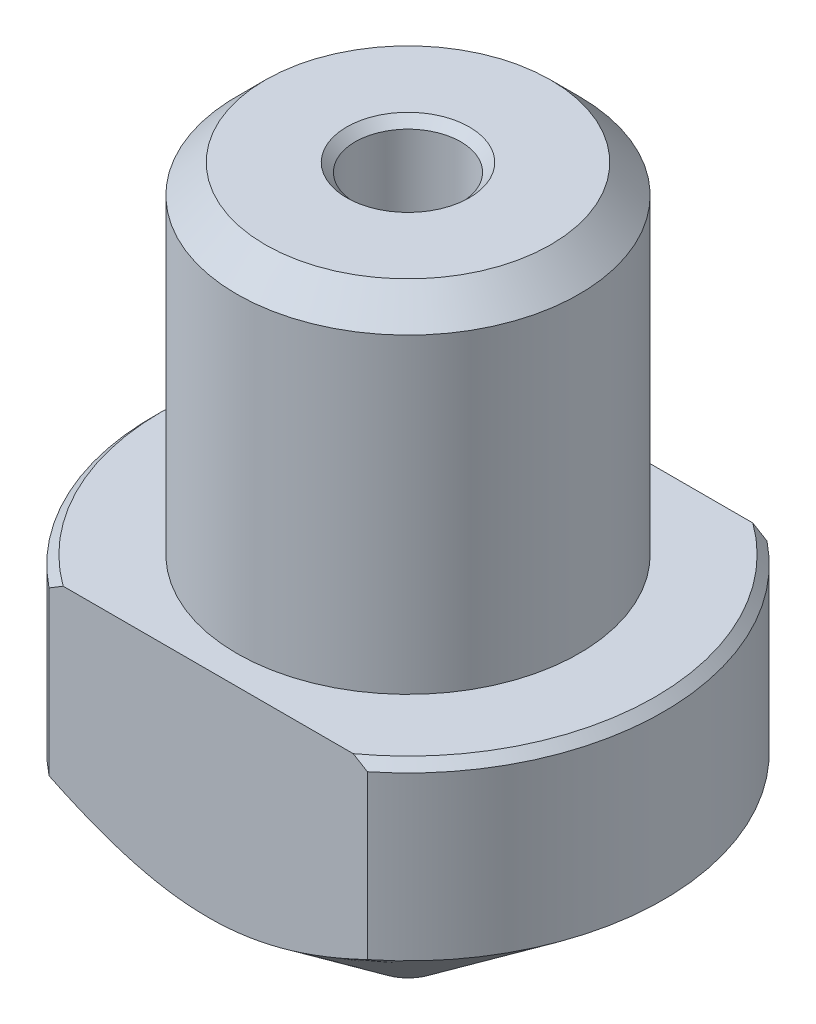
ISO-10303-21;
HEADER;
FILE_DESCRIPTION(('STEP AP214'),'2;1');
FILE_NAME('part.step','',(''),(''),'','','');
FILE_SCHEMA(('AUTOMOTIVE_DESIGN { 1 0 10303 214 1 1 1 1 }'));
ENDSEC;
DATA;
#1=APPLICATION_CONTEXT('core data for automotive mechanical design processes');
#2=APPLICATION_PROTOCOL_DEFINITION('international standard','automotive_design',2000,#1);
#3=PRODUCT_CONTEXT('',#1,'mechanical');
#4=PRODUCT('Part','Part','',(#3));
#5=PRODUCT_RELATED_PRODUCT_CATEGORY('part','',(#4));
#6=PRODUCT_DEFINITION_FORMATION('','',#4);
#7=PRODUCT_DEFINITION_CONTEXT('part definition',#1,'design');
#8=PRODUCT_DEFINITION('design','',#6,#7);
#9=PRODUCT_DEFINITION_SHAPE('','',#8);
#10=(LENGTH_UNIT() NAMED_UNIT(*) SI_UNIT(.MILLI.,.METRE.));
#11=(NAMED_UNIT(*) PLANE_ANGLE_UNIT() SI_UNIT($,.RADIAN.));
#12=(NAMED_UNIT(*) SI_UNIT($,.STERADIAN.) SOLID_ANGLE_UNIT());
#13=UNCERTAINTY_MEASURE_WITH_UNIT(LENGTH_MEASURE(1.E-05),#10,'distance_accuracy_value','');
#14=(GEOMETRIC_REPRESENTATION_CONTEXT(3) GLOBAL_UNCERTAINTY_ASSIGNED_CONTEXT((#13)) GLOBAL_UNIT_ASSIGNED_CONTEXT((#10,
#11,#12)) REPRESENTATION_CONTEXT('',''));
#15=CARTESIAN_POINT('',(0.,0.,0.));
#16=DIRECTION('',(0.,0.,1.));
#17=DIRECTION('',(1.,0.,0.));
#18=AXIS2_PLACEMENT_3D('',#15,#16,#17);
#19=CARTESIAN_POINT('',(0.,16.0512029311638,0.));
#20=DIRECTION('',(0.,1.,0.));
#21=DIRECTION('',(0.,0.,1.));
#22=AXIS2_PLACEMENT_3D('',#19,#20,#21);
#23=CYLINDRICAL_SURFACE('',#22,4.475);
#24=DIRECTION('',(0.,1.,0.));
#25=VECTOR('',#24,1.);
#26=CARTESIAN_POINT('',(-2.78848076916446,16.0512029311638,3.5));
#27=LINE('',#26,#25);
#28=CARTESIAN_POINT('',(-2.78848076916446,-0.150000000000001,3.5));
#29=VERTEX_POINT('',#28);
#30=CARTESIAN_POINT('',(-2.78848076916446,-3.,3.5));
#31=VERTEX_POINT('',#30);
#32=EDGE_CURVE('E114',#29,#31,#27,.F.);
#33=ORIENTED_EDGE('',*,*,#32,.F.);
#34=CARTESIAN_POINT('',(0.,-0.150000000000001,0.));
#35=DIRECTION('',(0.,-1.,0.));
#36=DIRECTION('',(0.,0.,-1.));
#37=AXIS2_PLACEMENT_3D('',#34,#35,#36);
#38=CIRCLE('',#37,4.475);
#39=CARTESIAN_POINT('',(-2.78848076916446,-0.150000000000001,-3.5));
#40=VERTEX_POINT('',#39);
#41=EDGE_CURVE('E70',#29,#40,#38,.T.);
#42=ORIENTED_EDGE('',*,*,#41,.T.);
#43=DIRECTION('',(0.,1.,0.));
#44=VECTOR('',#43,1.);
#45=CARTESIAN_POINT('',(-2.78848076916446,16.0512029311638,-3.5));
#46=LINE('',#45,#44);
#47=CARTESIAN_POINT('',(-2.78848076916446,-3.,-3.5));
#48=VERTEX_POINT('',#47);
#49=EDGE_CURVE('E211',#48,#40,#46,.T.);
#50=ORIENTED_EDGE('',*,*,#49,.F.);
#51=CARTESIAN_POINT('',(0.,-3.,0.));
#52=DIRECTION('',(0.,1.,0.));
#53=DIRECTION('',(0.,0.,1.));
#54=AXIS2_PLACEMENT_3D('',#51,#52,#53);
#55=CIRCLE('',#54,4.475);
#56=EDGE_CURVE('E134',#48,#31,#55,.T.);
#57=ORIENTED_EDGE('',*,*,#56,.T.);
#58=EDGE_LOOP('',(#33,#42,#50,#57));
#59=FACE_BOUND('',#58,.T.);
#60=ADVANCED_FACE('F40',(#59),#23,.T.);
#61=CARTESIAN_POINT('',(0.,-4.43870967741935,0.));
#62=DIRECTION('',(0.,1.,0.));
#63=DIRECTION('',(0.,0.,1.));
#64=AXIS2_PLACEMENT_3D('',#61,#62,#63);
#65=CONICAL_SURFACE('',#64,0.925000000000002,0.911990290677417);
#66=CARTESIAN_POINT('',(0.,-5.,0.));
#67=DIRECTION('',(0.,1.,0.));
#68=DIRECTION('',(0.,0.,1.));
#69=AXIS2_PLACEMENT_3D('',#66,#67,#68);
#70=CIRCLE('',#69,0.200000000000003);
#71=CARTESIAN_POINT('',(0.,-5.,0.200000000000002));
#72=VERTEX_POINT('',#71);
#73=EDGE_CURVE('E153',#72,#72,#70,.T.);
#74=CARTESIAN_POINT('',(0.,-4.43870967741935,0.));
#75=DIRECTION('',(0.,1.,0.));
#76=DIRECTION('',(0.,0.,1.));
#77=AXIS2_PLACEMENT_3D('',#74,#75,#76);
#78=CIRCLE('',#77,0.925000000000002);
#79=CARTESIAN_POINT('',(0.,-4.43870967741935,0.925000000000002));
#80=VERTEX_POINT('',#79);
#81=EDGE_CURVE('E142',#80,#80,#78,.T.);
#82=CARTESIAN_POINT('',(0.,-5.,0.200000000000002));
#83=CARTESIAN_POINT('',(0.,-4.99415322580645,0.207552083333336));
#84=CARTESIAN_POINT('',(0.,-4.9883064516129,0.215104166666669));
#85=CARTESIAN_POINT('',(0.,-4.97661290322581,0.230208333333336));
#86=CARTESIAN_POINT('',(0.,-4.97076612903226,0.237760416666669));
#87=CARTESIAN_POINT('',(0.,-4.95907258064516,0.252864583333335));
#88=CARTESIAN_POINT('',(0.,-4.95322580645161,0.260416666666669));
#89=CARTESIAN_POINT('',(0.,-4.94153225806452,0.275520833333336));
#90=CARTESIAN_POINT('',(0.,-4.93568548387097,0.283072916666669));
#91=CARTESIAN_POINT('',(0.,-4.92399193548387,0.298177083333335));
#92=CARTESIAN_POINT('',(0.,-4.91814516129032,0.305729166666669));
#93=CARTESIAN_POINT('',(0.,-4.90645161290323,0.320833333333336));
#94=CARTESIAN_POINT('',(0.,-4.90060483870968,0.328385416666669));
#95=CARTESIAN_POINT('',(0.,-4.88891129032258,0.343489583333335));
#96=CARTESIAN_POINT('',(0.,-4.88306451612903,0.351041666666669));
#97=CARTESIAN_POINT('',(0.,-4.87137096774194,0.366145833333336));
#98=CARTESIAN_POINT('',(0.,-4.86552419354839,0.373697916666669));
#99=CARTESIAN_POINT('',(0.,-4.85383064516129,0.388802083333335));
#100=CARTESIAN_POINT('',(0.,-4.84798387096774,0.396354166666669));
#101=CARTESIAN_POINT('',(0.,-4.83629032258065,0.411458333333336));
#102=CARTESIAN_POINT('',(0.,-4.8304435483871,0.419010416666669));
#103=CARTESIAN_POINT('',(0.,-4.81875,0.434114583333335));
#104=CARTESIAN_POINT('',(0.,-4.81290322580645,0.441666666666669));
#105=CARTESIAN_POINT('',(0.,-4.80120967741936,0.456770833333336));
#106=CARTESIAN_POINT('',(0.,-4.79536290322581,0.464322916666669));
#107=CARTESIAN_POINT('',(0.,-4.78366935483871,0.479427083333335));
#108=CARTESIAN_POINT('',(0.,-4.77782258064516,0.486979166666669));
#109=CARTESIAN_POINT('',(0.,-4.76612903225806,0.502083333333336));
#110=CARTESIAN_POINT('',(0.,-4.76028225806452,0.509635416666669));
#111=CARTESIAN_POINT('',(0.,-4.74858870967742,0.524739583333335));
#112=CARTESIAN_POINT('',(0.,-4.74274193548387,0.532291666666669));
#113=CARTESIAN_POINT('',(0.,-4.73104838709677,0.547395833333336));
#114=CARTESIAN_POINT('',(0.,-4.72520161290322,0.554947916666669));
#115=CARTESIAN_POINT('',(0.,-4.71350806451613,0.570052083333335));
#116=CARTESIAN_POINT('',(0.,-4.70766129032258,0.577604166666669));
#117=CARTESIAN_POINT('',(0.,-4.69596774193548,0.592708333333336));
#118=CARTESIAN_POINT('',(0.,-4.69012096774193,0.600260416666669));
#119=CARTESIAN_POINT('',(0.,-4.67842741935484,0.615364583333335));
#120=CARTESIAN_POINT('',(0.,-4.67258064516129,0.622916666666669));
#121=CARTESIAN_POINT('',(0.,-4.66088709677419,0.638020833333336));
#122=CARTESIAN_POINT('',(0.,-4.65504032258064,0.645572916666668));
#123=CARTESIAN_POINT('',(0.,-4.64334677419355,0.660677083333335));
#124=CARTESIAN_POINT('',(0.,-4.6375,0.668229166666669));
#125=CARTESIAN_POINT('',(0.,-4.6258064516129,0.683333333333336));
#126=CARTESIAN_POINT('',(0.,-4.61995967741935,0.690885416666669));
#127=CARTESIAN_POINT('',(0.,-4.60826612903226,0.705989583333335));
#128=CARTESIAN_POINT('',(0.,-4.60241935483871,0.713541666666669));
#129=CARTESIAN_POINT('',(0.,-4.59072580645161,0.728645833333335));
#130=CARTESIAN_POINT('',(0.,-4.58487903225806,0.736197916666669));
#131=CARTESIAN_POINT('',(0.,-4.57318548387097,0.751302083333335));
#132=CARTESIAN_POINT('',(0.,-4.56733870967742,0.758854166666669));
#133=CARTESIAN_POINT('',(0.,-4.55564516129032,0.773958333333336));
#134=CARTESIAN_POINT('',(0.,-4.54979838709677,0.781510416666669));
#135=CARTESIAN_POINT('',(0.,-4.53810483870968,0.796614583333335));
#136=CARTESIAN_POINT('',(0.,-4.53225806451613,0.804166666666669));
#137=CARTESIAN_POINT('',(0.,-4.52056451612903,0.819270833333336));
#138=CARTESIAN_POINT('',(0.,-4.51471774193548,0.826822916666669));
#139=CARTESIAN_POINT('',(0.,-4.50302419354839,0.841927083333335));
#140=CARTESIAN_POINT('',(0.,-4.49717741935484,0.849479166666669));
#141=CARTESIAN_POINT('',(0.,-4.48548387096774,0.864583333333335));
#142=CARTESIAN_POINT('',(0.,-4.47963709677419,0.872135416666668));
#143=CARTESIAN_POINT('',(0.,-4.46794354838709,0.887239583333335));
#144=CARTESIAN_POINT('',(0.,-4.46209677419355,0.894791666666669));
#145=CARTESIAN_POINT('',(0.,-4.45040322580645,0.909895833333336));
#146=CARTESIAN_POINT('',(0.,-4.4445564516129,0.917447916666669));
#147=CARTESIAN_POINT('',(0.,-4.43870967741935,0.925000000000002));
#148=B_SPLINE_CURVE_WITH_KNOTS('',3,(#82,#83,#84,#85,#86,#87,#88,#89,#90,#91,#92,#93,#94,#95,
#96,#97,#98,#99,#100,#101,#102,#103,#104,#105,#106,#107,#108,#109,#110,#111,#112,#113,#114,#115,
#116,#117,#118,#119,#120,#121,#122,#123,#124,#125,#126,#127,#128,#129,#130,#131,#132,#133,#134,
#135,#136,#137,#138,#139,#140,#141,#142,#143,#144,#145,#146,#147),.UNSPECIFIED.,.F.,.F.,(4,2,2,
2,2,2,2,2,2,2,2,2,2,2,2,2,2,2,2,2,2,2,2,2,2,2,2,2,2,2,2,2,4),(0.,0.0286525492809203,
0.0573050985618416,0.0859576478427617,0.114610197123683,0.143262746404603,0.171915295685525,
0.200567844966445,0.229220394247366,0.257872943528286,0.286525492809208,0.315178042090128,
0.343830591371049,0.37248314065197,0.401135689932891,0.429788239213811,0.458440788494733,
0.487093337775653,0.515745887056574,0.544398436337494,0.573050985618416,0.601703534899336,
0.630356084180257,0.659008633461177,0.687661182742099,0.716313732023019,0.74496628130394,
0.77361883058486,0.802271379865782,0.830923929146702,0.859576478427623,0.888229027708544,
0.916881576989465),.UNSPECIFIED.);
#149=EDGE_CURVE('BSEAM252',#72,#80,#148,.T.);
#150=ORIENTED_EDGE('',*,*,#73,.F.);
#151=ORIENTED_EDGE('',*,*,#81,.T.);
#152=ORIENTED_EDGE('',*,*,#149,.T.);
#153=ORIENTED_EDGE('',*,*,#149,.F.);
#154=EDGE_LOOP('',(#150,#152,#151,#153));
#155=FACE_BOUND('',#154,.T.);
#156=ADVANCED_FACE('F252',(#155),#65,.F.);
#157=CARTESIAN_POINT('',(0.,16.0512029311638,0.));
#158=DIRECTION('',(0.,1.,0.));
#159=DIRECTION('',(0.,0.,1.));
#160=AXIS2_PLACEMENT_3D('',#157,#158,#159);
#161=CYLINDRICAL_SURFACE('',#160,0.200000000000003);
#162=CARTESIAN_POINT('',(0.,-6.,0.));
#163=DIRECTION('',(0.,1.,0.));
#164=DIRECTION('',(0.,0.,1.));
#165=AXIS2_PLACEMENT_3D('',#162,#163,#164);
#166=CIRCLE('',#165,0.200000000000003);
#167=CARTESIAN_POINT('',(0.,-6.,0.200000000000003));
#168=VERTEX_POINT('',#167);
#169=EDGE_CURVE('E149',#168,#168,#166,.T.);
#170=ORIENTED_EDGE('',*,*,#169,.F.);
#171=EDGE_LOOP('',(#170));
#172=FACE_BOUND('',#171,.T.);
#173=ORIENTED_EDGE('',*,*,#73,.T.);
#174=EDGE_LOOP('',(#173));
#175=FACE_BOUND('',#174,.T.);
#176=ADVANCED_FACE('F255',(#172,#175),#161,.F.);
#177=CARTESIAN_POINT('',(0.,-6.,-0.600000000000003));
#178=DIRECTION('',(0.,1.,0.));
#179=DIRECTION('',(0.,0.,1.));
#180=AXIS2_PLACEMENT_3D('',#177,#178,#179);
#181=PLANE('',#180);
#182=CARTESIAN_POINT('',(0.,-6.,0.));
#183=DIRECTION('',(0.,1.,0.));
#184=DIRECTION('',(0.,0.,1.));
#185=AXIS2_PLACEMENT_3D('',#182,#183,#184);
#186=CIRCLE('',#185,0.600000000000003);
#187=CARTESIAN_POINT('',(0.,-6.,0.600000000000003));
#188=VERTEX_POINT('',#187);
#189=EDGE_CURVE('E139',#188,#188,#186,.T.);
#190=ORIENTED_EDGE('',*,*,#189,.F.);
#191=EDGE_LOOP('',(#190));
#192=FACE_BOUND('',#191,.T.);
#193=ORIENTED_EDGE('',*,*,#169,.T.);
#194=EDGE_LOOP('',(#193));
#195=FACE_BOUND('',#194,.T.);
#196=ADVANCED_FACE('F259',(#192,#195),#181,.F.);
#197=CARTESIAN_POINT('',(0.,-6.,0.));
#198=DIRECTION('',(0.,1.,0.));
#199=DIRECTION('',(0.,0.,1.));
#200=AXIS2_PLACEMENT_3D('',#197,#198,#199);
#201=CONICAL_SURFACE('',#200,0.600000000000003,0.91199029067742);
#202=CARTESIAN_POINT('',(2.78848076916446,-3.,3.5));
#203=VERTEX_POINT('',#202);
#204=CARTESIAN_POINT('',(2.78848076916446,-3.,-3.5));
#205=VERTEX_POINT('',#204);
#206=EDGE_CURVE('E125',#203,#205,#55,.T.);
#207=ORIENTED_EDGE('',*,*,#206,.F.);
#208=CARTESIAN_POINT('',(-5.88189790488484,-1.16557424940452,3.5));
#209=CARTESIAN_POINT('',(-5.73164839963552,-1.26551564660223,3.5));
#210=CARTESIAN_POINT('',(-5.58095230263866,-1.36479466175223,3.5));
#211=CARTESIAN_POINT('',(-5.27842902790053,-1.56166405671316,3.5));
#212=CARTESIAN_POINT('',(-5.12660167952328,-1.65925417408259,3.5));
#213=CARTESIAN_POINT('',(-4.82067036325214,-1.85295477676805,3.5));
#214=CARTESIAN_POINT('',(-4.66655809541282,-1.94905218920537,3.5));
#215=CARTESIAN_POINT('',(-4.3567143218424,-2.13858652847236,3.5));
#216=CARTESIAN_POINT('',(-4.20098290927845,-2.23202360723621,3.5));
#217=CARTESIAN_POINT('',(-3.87491605471066,-2.42290865719028,3.5));
#218=CARTESIAN_POINT('',(-3.70441428825805,-2.52007388162644,3.5));
#219=CARTESIAN_POINT('',(-3.36049763353232,-2.70921604369285,3.5));
#220=CARTESIAN_POINT('',(-3.18708221624171,-2.80119202563265,3.5));
#221=CARTESIAN_POINT('',(-2.83709845323278,-2.97793111620599,3.5));
#222=CARTESIAN_POINT('',(-2.6605385572302,-3.0627108082161,3.5));
#223=CARTESIAN_POINT('',(-2.30318864381273,-3.22273985502127,3.5));
#224=CARTESIAN_POINT('',(-2.12240064602443,-3.2979936541523,3.5));
#225=CARTESIAN_POINT('',(-1.76846168216527,-3.43078336805719,3.5));
#226=CARTESIAN_POINT('',(-1.59563977673534,-3.4891815246618,3.5));
#227=CARTESIAN_POINT('',(-1.2456112664733,-3.59109093792747,3.5));
#228=CARTESIAN_POINT('',(-1.06840582565859,-3.63460610211119,3.5));
#229=CARTESIAN_POINT('',(-0.714678271749285,-3.70201702738933,3.5));
#230=CARTESIAN_POINT('',(-0.538247114326054,-3.72637023860228,3.5));
#231=CARTESIAN_POINT('',(-0.272445369032831,-3.74750459445033,3.5));
#232=CARTESIAN_POINT('',(-0.183646484765789,-3.75198326050827,3.5));
#233=CARTESIAN_POINT('',(-0.00594076877256364,-3.75570687383801,3.5));
#234=CARTESIAN_POINT('',(0.0829660582366901,-3.7549520421194,3.5));
#235=CARTESIAN_POINT('',(0.323617200759191,-3.74580719647845,3.5));
#236=CARTESIAN_POINT('',(0.475193498155028,-3.73238037034587,3.5));
#237=CARTESIAN_POINT('',(0.776358240663111,-3.69135825867512,3.5));
#238=CARTESIAN_POINT('',(0.925946460846536,-3.66376138371957,3.5));
#239=CARTESIAN_POINT('',(1.22594553501344,-3.5956243811889,3.5));
#240=CARTESIAN_POINT('',(1.37628747294569,-3.55478499462746,3.5));
#241=CARTESIAN_POINT('',(1.59934140509133,-3.48580781480235,3.5));
#242=CARTESIAN_POINT('',(1.67328481514843,-3.46152832524748,3.5));
#243=CARTESIAN_POINT('',(1.82037791106009,-3.41067358990004,3.5));
#244=CARTESIAN_POINT('',(1.89352761637576,-3.38409840054037,3.5));
#245=CARTESIAN_POINT('',(2.09002442210262,-3.30958929853729,3.5));
#246=CARTESIAN_POINT('',(2.21264294264996,-3.25973322547316,3.5));
#247=CARTESIAN_POINT('',(2.45584671742397,-3.15526213378025,3.5));
#248=CARTESIAN_POINT('',(2.57643152577103,-3.10064608733546,3.5));
#249=CARTESIAN_POINT('',(2.81586773563287,-2.98752456491837,3.5));
#250=CARTESIAN_POINT('',(2.93471773936787,-2.92901614320467,3.5));
#251=CARTESIAN_POINT('',(3.17082474112645,-2.80886029874127,3.5));
#252=CARTESIAN_POINT('',(3.28808160426777,-2.74721261227983,3.5));
#253=CARTESIAN_POINT('',(3.63878757772353,-2.55790859207043,3.5));
#254=CARTESIAN_POINT('',(3.87014870011178,-2.42638713364467,3.5));
#255=CARTESIAN_POINT('',(4.32861994087952,-2.15642906638853,3.5));
#256=CARTESIAN_POINT('',(4.55573178342356,-2.01799534972697,3.5));
#257=CARTESIAN_POINT('',(4.98350527147858,-1.75075851108294,3.5));
#258=CARTESIAN_POINT('',(5.18447171485298,-1.62244148390226,3.5));
#259=CARTESIAN_POINT('',(5.58447429630348,-1.3627927154809,3.5));
#260=CARTESIAN_POINT('',(5.78351021261082,-1.23146063358691,3.5));
#261=CARTESIAN_POINT('',(6.17812595454277,-0.967775815235563,3.5));
#262=CARTESIAN_POINT('',(6.37372059298669,-0.835445192360116,3.5));
#263=CARTESIAN_POINT('',(6.76364346658176,-0.569011118431182,3.5));
#264=CARTESIAN_POINT('',(6.95797194231317,-0.434908019750318,3.5));
#265=CARTESIAN_POINT('',(7.1518280143833,-0.30013429075097,3.5));
#266=B_SPLINE_CURVE_WITH_KNOTS('',3,(#208,#209,#210,#211,#212,#213,#214,#215,#216,#217,#218,
#219,#220,#221,#222,#223,#224,#225,#226,#227,#228,#229,#230,#231,#232,#233,#234,#235,#236,#237,
#238,#239,#240,#241,#242,#243,#244,#245,#246,#247,#248,#249,#250,#251,#252,#253,#254,#255,#256,
#257,#258,#259,#260,#261,#262,#263,#264,#265),.UNSPECIFIED.,.F.,.F.,(4,2,2,2,2,2,2,2,2,2,2,2,2,
2,2,2,2,2,2,2,2,2,2,2,2,2,2,2,4),(0.,0.541363930478592,1.08281124270189,1.62764522053172,
2.17244801970772,2.76111376271559,3.34988756735981,3.93726550139954,4.52436837433031,
5.07112153741645,5.61773104032323,6.15085809063127,6.41745622508821,6.68404310122713,
7.13975815100225,7.59552432831508,8.06240623656228,8.2958595740059,8.52930717433362,
8.92627265745613,9.32332407029602,9.72067946642711,10.1180682973643,10.9162540417148,
11.7141085696474,12.4293883089419,13.1447492651369,13.8532000904832,14.5615121314164),.UNSPECIFIED.);
#267=EDGE_CURVE('E108',#31,#203,#266,.T.);
#268=ORIENTED_EDGE('',*,*,#267,.F.);
#269=ORIENTED_EDGE('',*,*,#56,.F.);
#270=CARTESIAN_POINT('',(-5.88189790488484,-1.16557424940452,-3.5));
#271=CARTESIAN_POINT('',(-5.73164839963552,-1.26551564660223,-3.5));
#272=CARTESIAN_POINT('',(-5.58095230263866,-1.36479466175223,-3.5));
#273=CARTESIAN_POINT('',(-5.27842902790053,-1.56166405671316,-3.5));
#274=CARTESIAN_POINT('',(-5.12660167952328,-1.65925417408259,-3.5));
#275=CARTESIAN_POINT('',(-4.82067036325214,-1.85295477676805,-3.5));
#276=CARTESIAN_POINT('',(-4.66655809541282,-1.94905218920537,-3.5));
#277=CARTESIAN_POINT('',(-4.3567143218424,-2.13858652847236,-3.5));
#278=CARTESIAN_POINT('',(-4.20098290927845,-2.23202360723621,-3.5));
#279=CARTESIAN_POINT('',(-3.87491605471066,-2.42290865719028,-3.5));
#280=CARTESIAN_POINT('',(-3.70441428825805,-2.52007388162644,-3.5));
#281=CARTESIAN_POINT('',(-3.36049763353232,-2.70921604369285,-3.5));
#282=CARTESIAN_POINT('',(-3.18708221624171,-2.80119202563265,-3.5));
#283=CARTESIAN_POINT('',(-2.83709845323278,-2.97793111620599,-3.5));
#284=CARTESIAN_POINT('',(-2.6605385572302,-3.0627108082161,-3.5));
#285=CARTESIAN_POINT('',(-2.30318864381273,-3.22273985502127,-3.5));
#286=CARTESIAN_POINT('',(-2.12240064602443,-3.2979936541523,-3.5));
#287=CARTESIAN_POINT('',(-1.76846168216527,-3.43078336805719,-3.5));
#288=CARTESIAN_POINT('',(-1.59563977673534,-3.4891815246618,-3.5));
#289=CARTESIAN_POINT('',(-1.2456112664733,-3.59109093792747,-3.5));
#290=CARTESIAN_POINT('',(-1.06840582565859,-3.63460610211119,-3.5));
#291=CARTESIAN_POINT('',(-0.714678271749285,-3.70201702738933,-3.5));
#292=CARTESIAN_POINT('',(-0.538247114326054,-3.72637023860228,-3.5));
#293=CARTESIAN_POINT('',(-0.272445369032831,-3.74750459445033,-3.5));
#294=CARTESIAN_POINT('',(-0.183646484765789,-3.75198326050827,-3.5));
#295=CARTESIAN_POINT('',(-0.00594076877256364,-3.75570687383801,-3.5));
#296=CARTESIAN_POINT('',(0.0829660582366901,-3.7549520421194,-3.5));
#297=CARTESIAN_POINT('',(0.323617200759191,-3.74580719647845,-3.5));
#298=CARTESIAN_POINT('',(0.475193498155028,-3.73238037034587,-3.5));
#299=CARTESIAN_POINT('',(0.776358240663111,-3.69135825867512,-3.5));
#300=CARTESIAN_POINT('',(0.925946460846536,-3.66376138371957,-3.5));
#301=CARTESIAN_POINT('',(1.22594553501344,-3.5956243811889,-3.5));
#302=CARTESIAN_POINT('',(1.37628747294569,-3.55478499462746,-3.5));
#303=CARTESIAN_POINT('',(1.59934140509133,-3.48580781480235,-3.5));
#304=CARTESIAN_POINT('',(1.67328481514843,-3.46152832524748,-3.5));
#305=CARTESIAN_POINT('',(1.82037791106009,-3.41067358990004,-3.5));
#306=CARTESIAN_POINT('',(1.89352761637576,-3.38409840054037,-3.5));
#307=CARTESIAN_POINT('',(2.09002442210262,-3.30958929853729,-3.5));
#308=CARTESIAN_POINT('',(2.21264294264996,-3.25973322547316,-3.5));
#309=CARTESIAN_POINT('',(2.45584671742397,-3.15526213378025,-3.5));
#310=CARTESIAN_POINT('',(2.57643152577103,-3.10064608733546,-3.5));
#311=CARTESIAN_POINT('',(2.81586773563287,-2.98752456491837,-3.5));
#312=CARTESIAN_POINT('',(2.93471773936787,-2.92901614320467,-3.5));
#313=CARTESIAN_POINT('',(3.17082474112645,-2.80886029874127,-3.5));
#314=CARTESIAN_POINT('',(3.28808160426777,-2.74721261227983,-3.5));
#315=CARTESIAN_POINT('',(3.63878757772353,-2.55790859207043,-3.5));
#316=CARTESIAN_POINT('',(3.87014870011178,-2.42638713364467,-3.5));
#317=CARTESIAN_POINT('',(4.32861994087952,-2.15642906638853,-3.5));
#318=CARTESIAN_POINT('',(4.55573178342356,-2.01799534972697,-3.5));
#319=CARTESIAN_POINT('',(4.98350527147858,-1.75075851108294,-3.5));
#320=CARTESIAN_POINT('',(5.18447171485298,-1.62244148390226,-3.5));
#321=CARTESIAN_POINT('',(5.58447429630348,-1.3627927154809,-3.5));
#322=CARTESIAN_POINT('',(5.78351021261082,-1.23146063358691,-3.5));
#323=CARTESIAN_POINT('',(6.17812595454277,-0.967775815235563,-3.5));
#324=CARTESIAN_POINT('',(6.37372059298669,-0.835445192360116,-3.5));
#325=CARTESIAN_POINT('',(6.76364346658176,-0.569011118431182,-3.5));
#326=CARTESIAN_POINT('',(6.95797194231317,-0.434908019750318,-3.5));
#327=CARTESIAN_POINT('',(7.1518280143833,-0.30013429075097,-3.5));
#328=B_SPLINE_CURVE_WITH_KNOTS('',3,(#270,#271,#272,#273,#274,#275,#276,#277,#278,#279,#280,
#281,#282,#283,#284,#285,#286,#287,#288,#289,#290,#291,#292,#293,#294,#295,#296,#297,#298,#299,
#300,#301,#302,#303,#304,#305,#306,#307,#308,#309,#310,#311,#312,#313,#314,#315,#316,#317,#318,
#319,#320,#321,#322,#323,#324,#325,#326,#327),.UNSPECIFIED.,.F.,.F.,(4,2,2,2,2,2,2,2,2,2,2,2,2,
2,2,2,2,2,2,2,2,2,2,2,2,2,2,2,4),(0.,0.541363930478592,1.08281124270189,1.62764522053172,
2.17244801970772,2.76111376271559,3.34988756735981,3.93726550139954,4.52436837433031,
5.07112153741645,5.61773104032323,6.15085809063127,6.41745622508821,6.68404310122713,
7.13975815100225,7.59552432831508,8.06240623656228,8.2958595740059,8.52930717433362,
8.92627265745613,9.32332407029602,9.72067946642711,10.1180682973643,10.9162540417148,
11.7141085696474,12.4293883089419,13.1447492651369,13.8532000904832,14.5615121314164),.UNSPECIFIED.);
#329=EDGE_CURVE('E132',#205,#48,#328,.F.);
#330=ORIENTED_EDGE('',*,*,#329,.F.);
#331=EDGE_LOOP('',(#207,#268,#269,#330));
#332=FACE_BOUND('',#331,.T.);
#333=ORIENTED_EDGE('',*,*,#189,.T.);
#334=EDGE_LOOP('',(#333));
#335=FACE_BOUND('',#334,.T.);
#336=ADVANCED_FACE('F130',(#332,#335),#201,.T.);
#337=DIRECTION('',(0.,1.,0.));
#338=VECTOR('',#337,1.);
#339=CARTESIAN_POINT('',(2.78848076916446,16.0512029311638,-3.5));
#340=LINE('',#339,#338);
#341=CARTESIAN_POINT('',(2.78848076916446,-0.150000000000001,-3.5));
#342=VERTEX_POINT('',#341);
#343=EDGE_CURVE('E214',#342,#205,#340,.F.);
#344=ORIENTED_EDGE('',*,*,#343,.F.);
#345=CARTESIAN_POINT('',(0.,-0.150000000000001,0.));
#346=DIRECTION('',(0.,-1.,0.));
#347=DIRECTION('',(0.,0.,-1.));
#348=AXIS2_PLACEMENT_3D('',#345,#346,#347);
#349=CIRCLE('',#348,4.475);
#350=CARTESIAN_POINT('',(2.78848076916446,-0.150000000000001,3.5));
#351=VERTEX_POINT('',#350);
#352=EDGE_CURVE('E11',#342,#351,#349,.T.);
#353=ORIENTED_EDGE('',*,*,#352,.T.);
#354=DIRECTION('',(0.,1.,0.));
#355=VECTOR('',#354,1.);
#356=CARTESIAN_POINT('',(2.78848076916446,16.0512029311638,3.5));
#357=LINE('',#356,#355);
#358=EDGE_CURVE('E112',#203,#351,#357,.T.);
#359=ORIENTED_EDGE('',*,*,#358,.F.);
#360=ORIENTED_EDGE('',*,*,#206,.T.);
#361=EDGE_LOOP('',(#344,#353,#359,#360));
#362=FACE_BOUND('',#361,.T.);
#363=ADVANCED_FACE('F124',(#362),#23,.T.);
#364=CARTESIAN_POINT('',(0.,0.,-3.));
#365=DIRECTION('',(0.,-1.,0.));
#366=DIRECTION('',(0.,0.,-1.));
#367=AXIS2_PLACEMENT_3D('',#364,#365,#366);
#368=PLANE('',#367);
#369=CARTESIAN_POINT('',(0.,0.,0.));
#370=DIRECTION('',(0.,1.,0.));
#371=DIRECTION('',(0.,0.,1.));
#372=AXIS2_PLACEMENT_3D('',#369,#370,#371);
#373=CIRCLE('',#372,3.);
#374=CARTESIAN_POINT('',(0.,0.,3.));
#375=VERTEX_POINT('',#374);
#376=EDGE_CURVE('E135',#375,#375,#373,.T.);
#377=ORIENTED_EDGE('',*,*,#376,.F.);
#378=EDGE_LOOP('',(#377));
#379=FACE_BOUND('',#378,.T.);
#380=DIRECTION('',(1.,0.,0.));
#381=VECTOR('',#380,1.);
#382=CARTESIAN_POINT('',(-2.78848076916446,0.,-3.5));
#383=LINE('',#382,#381);
#384=CARTESIAN_POINT('',(-2.54079219929533,0.,-3.5));
#385=VERTEX_POINT('',#384);
#386=CARTESIAN_POINT('',(2.54079219929533,0.,-3.5));
#387=VERTEX_POINT('',#386);
#388=EDGE_CURVE('E216',#385,#387,#383,.T.);
#389=ORIENTED_EDGE('',*,*,#388,.F.);
#390=CARTESIAN_POINT('',(0.,0.,0.));
#391=DIRECTION('',(0.,-1.,0.));
#392=DIRECTION('',(0.,0.,-1.));
#393=AXIS2_PLACEMENT_3D('',#390,#391,#392);
#394=CIRCLE('',#393,4.325);
#395=CARTESIAN_POINT('',(-2.54079219929533,0.,3.5));
#396=VERTEX_POINT('',#395);
#397=EDGE_CURVE('E177',#385,#396,#394,.F.);
#398=ORIENTED_EDGE('',*,*,#397,.T.);
#399=DIRECTION('',(-1.,0.,0.));
#400=VECTOR('',#399,1.);
#401=CARTESIAN_POINT('',(-2.78848076916446,0.,3.5));
#402=LINE('',#401,#400);
#403=CARTESIAN_POINT('',(2.54079219929533,0.,3.5));
#404=VERTEX_POINT('',#403);
#405=EDGE_CURVE('E120',#404,#396,#402,.T.);
#406=ORIENTED_EDGE('',*,*,#405,.F.);
#407=CARTESIAN_POINT('',(0.,0.,0.));
#408=DIRECTION('',(0.,-1.,0.));
#409=DIRECTION('',(0.,0.,-1.));
#410=AXIS2_PLACEMENT_3D('',#407,#408,#409);
#411=CIRCLE('',#410,4.325);
#412=EDGE_CURVE('E173',#404,#387,#411,.F.);
#413=ORIENTED_EDGE('',*,*,#412,.T.);
#414=EDGE_LOOP('',(#389,#398,#406,#413));
#415=FACE_BOUND('',#414,.T.);
#416=ADVANCED_FACE('F268',(#379,#415),#368,.F.);
#417=CARTESIAN_POINT('',(0.,16.0512029311638,0.));
#418=DIRECTION('',(0.,1.,0.));
#419=DIRECTION('',(0.,0.,1.));
#420=AXIS2_PLACEMENT_3D('',#417,#418,#419);
#421=CYLINDRICAL_SURFACE('',#420,3.);
#422=CARTESIAN_POINT('',(0.,5.45,0.));
#423=DIRECTION('',(0.,-1.,0.));
#424=DIRECTION('',(0.,0.,-1.));
#425=AXIS2_PLACEMENT_3D('',#422,#423,#424);
#426=CIRCLE('',#425,3.);
#427=CARTESIAN_POINT('',(0.,5.45,-3.));
#428=VERTEX_POINT('',#427);
#429=EDGE_CURVE('E161',#428,#428,#426,.T.);
#430=ORIENTED_EDGE('',*,*,#429,.T.);
#431=EDGE_LOOP('',(#430));
#432=FACE_BOUND('',#431,.T.);
#433=ORIENTED_EDGE('',*,*,#376,.T.);
#434=EDGE_LOOP('',(#433));
#435=FACE_BOUND('',#434,.T.);
#436=ADVANCED_FACE('F271',(#432,#435),#421,.T.);
#437=CARTESIAN_POINT('',(0.,5.95,-0.925000000000002));
#438=DIRECTION('',(0.,-1.,0.));
#439=DIRECTION('',(0.,0.,-1.));
#440=AXIS2_PLACEMENT_3D('',#437,#438,#439);
#441=PLANE('',#440);
#442=CARTESIAN_POINT('',(0.,5.95,0.));
#443=DIRECTION('',(0.,-1.,0.));
#444=DIRECTION('',(0.,0.,-1.));
#445=AXIS2_PLACEMENT_3D('',#442,#443,#444);
#446=CIRCLE('',#445,1.075);
#447=CARTESIAN_POINT('',(0.,5.95,-1.075));
#448=VERTEX_POINT('',#447);
#449=EDGE_CURVE('E169',#448,#448,#446,.T.);
#450=ORIENTED_EDGE('',*,*,#449,.T.);
#451=EDGE_LOOP('',(#450));
#452=FACE_BOUND('',#451,.T.);
#453=CARTESIAN_POINT('',(0.,5.95,0.));
#454=DIRECTION('',(0.,-1.,0.));
#455=DIRECTION('',(0.,0.,-1.));
#456=AXIS2_PLACEMENT_3D('',#453,#454,#455);
#457=CIRCLE('',#456,2.5);
#458=CARTESIAN_POINT('',(0.,5.95,-2.5));
#459=VERTEX_POINT('',#458);
#460=EDGE_CURVE('E157',#459,#459,#457,.F.);
#461=ORIENTED_EDGE('',*,*,#460,.T.);
#462=EDGE_LOOP('',(#461));
#463=FACE_BOUND('',#462,.T.);
#464=ADVANCED_FACE('F274',(#452,#463),#441,.F.);
#465=CARTESIAN_POINT('',(0.,16.0512029311638,0.));
#466=DIRECTION('',(0.,1.,0.));
#467=DIRECTION('',(0.,0.,1.));
#468=AXIS2_PLACEMENT_3D('',#465,#466,#467);
#469=CYLINDRICAL_SURFACE('',#468,0.925000000000002);
#470=CARTESIAN_POINT('',(0.,5.8,0.));
#471=DIRECTION('',(0.,-1.,0.));
#472=DIRECTION('',(0.,0.,-1.));
#473=AXIS2_PLACEMENT_3D('',#470,#471,#472);
#474=CIRCLE('',#473,0.925000000000002);
#475=CARTESIAN_POINT('',(0.,5.8,-0.925000000000002));
#476=VERTEX_POINT('',#475);
#477=EDGE_CURVE('E165',#476,#476,#474,.F.);
#478=ORIENTED_EDGE('',*,*,#477,.T.);
#479=EDGE_LOOP('',(#478));
#480=FACE_BOUND('',#479,.T.);
#481=ORIENTED_EDGE('',*,*,#81,.F.);
#482=EDGE_LOOP('',(#481));
#483=FACE_BOUND('',#482,.T.);
#484=ADVANCED_FACE('F226',(#480,#483),#469,.F.);
#485=CARTESIAN_POINT('',(-2.78848076916446,-6.001,-3.5));
#486=DIRECTION('',(0.,0.,1.));
#487=DIRECTION('',(1.,0.,0.));
#488=AXIS2_PLACEMENT_3D('',#485,#486,#487);
#489=PLANE('',#488);
#490=ORIENTED_EDGE('',*,*,#49,.T.);
#491=CARTESIAN_POINT('',(-2.78848076916446,-0.150000000000001,-3.5));
#492=CARTESIAN_POINT('',(-2.74752540799136,-0.124461646857025,-3.5));
#493=CARTESIAN_POINT('',(-2.70640702833036,-0.0991924791520539,-3.5));
#494=CARTESIAN_POINT('',(-2.62384417218003,-0.0491924783714868,-3.5));
#495=CARTESIAN_POINT('',(-2.58239969521799,-0.0244616460764571,-3.5));
#496=CARTESIAN_POINT('',(-2.54079219929533,0.,-3.5));
#497=B_SPLINE_CURVE_WITH_KNOTS('',3,(#491,#492,#493,#494,#495,#496),.UNSPECIFIED.,.F.,.F.,(4,2,
4),(0.,0.144786974006764,0.289574157935301),.UNSPECIFIED.);
#498=EDGE_CURVE('E50',#40,#385,#497,.T.);
#499=ORIENTED_EDGE('',*,*,#498,.T.);
#500=ORIENTED_EDGE('',*,*,#388,.T.);
#501=CARTESIAN_POINT('',(2.54079219929533,0.,-3.5));
#502=CARTESIAN_POINT('',(2.58239969521799,-0.0244616460764578,-3.5));
#503=CARTESIAN_POINT('',(2.62384417218003,-0.0491924783714871,-3.5));
#504=CARTESIAN_POINT('',(2.70640702833036,-0.0991924791520537,-3.5));
#505=CARTESIAN_POINT('',(2.74752540799136,-0.124461646857025,-3.5));
#506=CARTESIAN_POINT('',(2.78848076916446,-0.15,-3.5));
#507=B_SPLINE_CURVE_WITH_KNOTS('',3,(#501,#502,#503,#504,#505,#506),.UNSPECIFIED.,.F.,.F.,(4,2,
4),(0.,0.144787183928537,0.289574157935301),.UNSPECIFIED.);
#508=EDGE_CURVE('E60',#387,#342,#507,.T.);
#509=ORIENTED_EDGE('',*,*,#508,.T.);
#510=ORIENTED_EDGE('',*,*,#343,.T.);
#511=ORIENTED_EDGE('',*,*,#329,.T.);
#512=EDGE_LOOP('',(#490,#499,#500,#509,#510,#511));
#513=FACE_BOUND('',#512,.T.);
#514=ADVANCED_FACE('F198',(#513),#489,.F.);
#515=CARTESIAN_POINT('',(-2.78848076916446,-6.001,3.5));
#516=DIRECTION('',(0.,0.,-1.));
#517=DIRECTION('',(-1.,0.,0.));
#518=AXIS2_PLACEMENT_3D('',#515,#516,#517);
#519=PLANE('',#518);
#520=ORIENTED_EDGE('',*,*,#405,.T.);
#521=CARTESIAN_POINT('',(-2.54079219929533,0.,3.5));
#522=CARTESIAN_POINT('',(-2.58239969521799,-0.0244616460764578,3.5));
#523=CARTESIAN_POINT('',(-2.62384417218003,-0.0491924783714871,3.5));
#524=CARTESIAN_POINT('',(-2.70640702833036,-0.0991924791520537,3.5));
#525=CARTESIAN_POINT('',(-2.74752540799136,-0.124461646857025,3.5));
#526=CARTESIAN_POINT('',(-2.78848076916446,-0.15,3.5));
#527=B_SPLINE_CURVE_WITH_KNOTS('',3,(#521,#522,#523,#524,#525,#526),.UNSPECIFIED.,.F.,.F.,(4,2,
4),(0.,0.144787183928537,0.289574157935301),.UNSPECIFIED.);
#528=EDGE_CURVE('E188',#396,#29,#527,.T.);
#529=ORIENTED_EDGE('',*,*,#528,.T.);
#530=ORIENTED_EDGE('',*,*,#32,.T.);
#531=ORIENTED_EDGE('',*,*,#267,.T.);
#532=ORIENTED_EDGE('',*,*,#358,.T.);
#533=CARTESIAN_POINT('',(2.78848076916446,-0.150000000000001,3.5));
#534=CARTESIAN_POINT('',(2.74752540799136,-0.124461646857025,3.5));
#535=CARTESIAN_POINT('',(2.70640702833036,-0.099192479152054,3.5));
#536=CARTESIAN_POINT('',(2.62384417218003,-0.049192478371487,3.5));
#537=CARTESIAN_POINT('',(2.58239969521799,-0.0244616460764573,3.5));
#538=CARTESIAN_POINT('',(2.54079219929533,0.,3.5));
#539=B_SPLINE_CURVE_WITH_KNOTS('',3,(#533,#534,#535,#536,#537,#538),.UNSPECIFIED.,.F.,.F.,(4,2,
4),(0.,0.144786974006765,0.289574157935301),.UNSPECIFIED.);
#540=EDGE_CURVE('E181',#351,#404,#539,.T.);
#541=ORIENTED_EDGE('',*,*,#540,.T.);
#542=EDGE_LOOP('',(#520,#529,#530,#531,#532,#541));
#543=FACE_BOUND('',#542,.T.);
#544=ADVANCED_FACE('F111',(#543),#519,.F.);
#545=CARTESIAN_POINT('',(0.,5.95,0.));
#546=DIRECTION('',(0.,-1.,0.));
#547=DIRECTION('',(0.,0.,-1.));
#548=AXIS2_PLACEMENT_3D('',#545,#546,#547);
#549=CONICAL_SURFACE('',#548,2.5,0.785398163397445);
#550=ORIENTED_EDGE('',*,*,#429,.F.);
#551=EDGE_LOOP('',(#550));
#552=FACE_BOUND('',#551,.T.);
#553=ORIENTED_EDGE('',*,*,#460,.F.);
#554=EDGE_LOOP('',(#553));
#555=FACE_BOUND('',#554,.T.);
#556=ADVANCED_FACE('F197',(#552,#555),#549,.T.);
#557=CARTESIAN_POINT('',(0.,5.8,0.));
#558=DIRECTION('',(0.,1.,0.));
#559=DIRECTION('',(0.,0.,1.));
#560=AXIS2_PLACEMENT_3D('',#557,#558,#559);
#561=CONICAL_SURFACE('',#560,0.925000000000002,0.785398163397447);
#562=ORIENTED_EDGE('',*,*,#449,.F.);
#563=EDGE_LOOP('',(#562));
#564=FACE_BOUND('',#563,.T.);
#565=ORIENTED_EDGE('',*,*,#477,.F.);
#566=EDGE_LOOP('',(#565));
#567=FACE_BOUND('',#566,.T.);
#568=ADVANCED_FACE('F243',(#564,#567),#561,.F.);
#569=CARTESIAN_POINT('',(0.,0.,0.));
#570=DIRECTION('',(0.,-1.,0.));
#571=DIRECTION('',(0.,0.,-1.));
#572=AXIS2_PLACEMENT_3D('',#569,#570,#571);
#573=CONICAL_SURFACE('',#572,4.325,0.785398163397443);
#574=ORIENTED_EDGE('',*,*,#498,.F.);
#575=ORIENTED_EDGE('',*,*,#41,.F.);
#576=ORIENTED_EDGE('',*,*,#528,.F.);
#577=ORIENTED_EDGE('',*,*,#397,.F.);
#578=EDGE_LOOP('',(#574,#575,#576,#577));
#579=FACE_BOUND('',#578,.T.);
#580=ADVANCED_FACE('F239',(#579),#573,.T.);
#581=CARTESIAN_POINT('',(0.,0.,0.));
#582=DIRECTION('',(0.,-1.,0.));
#583=DIRECTION('',(0.,0.,-1.));
#584=AXIS2_PLACEMENT_3D('',#581,#582,#583);
#585=CONICAL_SURFACE('',#584,4.325,0.785398163397443);
#586=ORIENTED_EDGE('',*,*,#540,.F.);
#587=ORIENTED_EDGE('',*,*,#352,.F.);
#588=ORIENTED_EDGE('',*,*,#508,.F.);
#589=ORIENTED_EDGE('',*,*,#412,.F.);
#590=EDGE_LOOP('',(#586,#587,#588,#589));
#591=FACE_BOUND('',#590,.T.);
#592=ADVANCED_FACE('F42',(#591),#585,.T.);
#593=CLOSED_SHELL('',(#60,#156,#176,#196,#336,#363,#416,#436,#464,#484,#514,#544,#556,#568,#580,#592));
#594=MANIFOLD_SOLID_BREP('B2',#593);
#595=ADVANCED_BREP_SHAPE_REPRESENTATION('',(#18,#594),#14);
#596=SHAPE_DEFINITION_REPRESENTATION(#9,#595);
ENDSEC;
END-ISO-10303-21;
